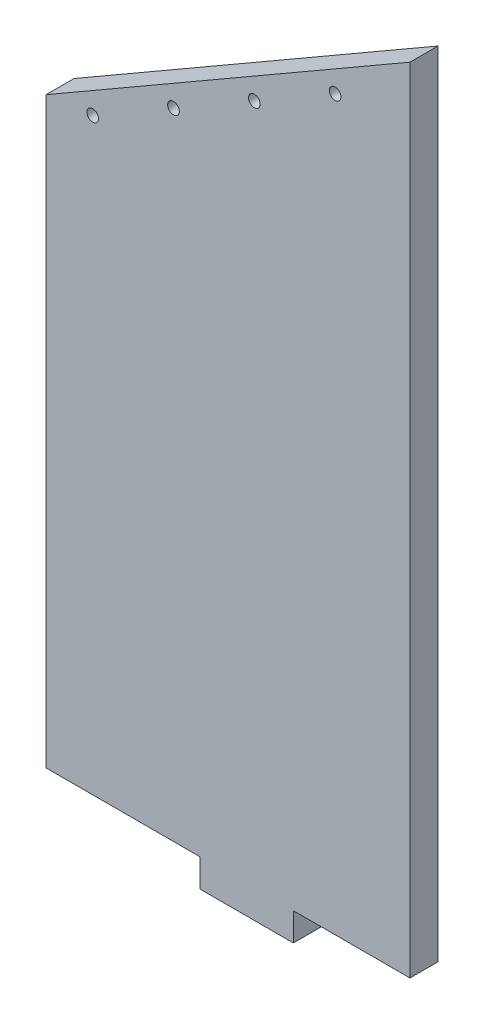
ISO-10303-21;
HEADER;
FILE_DESCRIPTION(('STEP AP214'),'2;1');
FILE_NAME('part.step','',(''),(''),'','','');
FILE_SCHEMA(('AUTOMOTIVE_DESIGN { 1 0 10303 214 1 1 1 1 }'));
ENDSEC;
DATA;
#1=APPLICATION_CONTEXT('core data for automotive mechanical design processes');
#2=APPLICATION_PROTOCOL_DEFINITION('international standard','automotive_design',2000,#1);
#3=PRODUCT_CONTEXT('',#1,'mechanical');
#4=PRODUCT('Part','Part','',(#3));
#5=PRODUCT_RELATED_PRODUCT_CATEGORY('part','',(#4));
#6=PRODUCT_DEFINITION_FORMATION('','',#4);
#7=PRODUCT_DEFINITION_CONTEXT('part definition',#1,'design');
#8=PRODUCT_DEFINITION('design','',#6,#7);
#9=PRODUCT_DEFINITION_SHAPE('','',#8);
#10=(LENGTH_UNIT() NAMED_UNIT(*) SI_UNIT(.MILLI.,.METRE.));
#11=(NAMED_UNIT(*) PLANE_ANGLE_UNIT() SI_UNIT($,.RADIAN.));
#12=(NAMED_UNIT(*) SI_UNIT($,.STERADIAN.) SOLID_ANGLE_UNIT());
#13=UNCERTAINTY_MEASURE_WITH_UNIT(LENGTH_MEASURE(1.E-05),#10,'distance_accuracy_value','');
#14=(GEOMETRIC_REPRESENTATION_CONTEXT(3) GLOBAL_UNCERTAINTY_ASSIGNED_CONTEXT((#13)) GLOBAL_UNIT_ASSIGNED_CONTEXT((#10,
#11,#12)) REPRESENTATION_CONTEXT('',''));
#15=CARTESIAN_POINT('',(0.,0.,0.));
#16=DIRECTION('',(0.,0.,1.));
#17=DIRECTION('',(1.,0.,0.));
#18=AXIS2_PLACEMENT_3D('',#15,#16,#17);
#19=CARTESIAN_POINT('',(0.,0.,6.));
#20=DIRECTION('',(0.,1.,0.));
#21=DIRECTION('',(-1.,0.,0.));
#22=AXIS2_PLACEMENT_3D('',#19,#20,#21);
#23=PLANE('',#22);
#24=DIRECTION('',(0.,0.,1.));
#25=VECTOR('',#24,1.);
#26=CARTESIAN_POINT('',(-25.,0.,0.));
#27=LINE('',#26,#25);
#28=CARTESIAN_POINT('',(-25.,0.,0.));
#29=VERTEX_POINT('',#28);
#30=CARTESIAN_POINT('',(-25.,0.,6.));
#31=VERTEX_POINT('',#30);
#32=EDGE_CURVE('E125',#29,#31,#27,.T.);
#33=ORIENTED_EDGE('',*,*,#32,.F.);
#34=DIRECTION('',(1.,0.,0.));
#35=VECTOR('',#34,1.);
#36=CARTESIAN_POINT('',(0.,0.,0.));
#37=LINE('',#36,#35);
#38=CARTESIAN_POINT('',(0.,0.,0.));
#39=VERTEX_POINT('',#38);
#40=EDGE_CURVE('E162',#29,#39,#37,.T.);
#41=ORIENTED_EDGE('',*,*,#40,.T.);
#42=DIRECTION('',(0.,0.,-1.));
#43=VECTOR('',#42,1.);
#44=CARTESIAN_POINT('',(0.,0.,6.));
#45=LINE('',#44,#43);
#46=CARTESIAN_POINT('',(0.,0.,6.));
#47=VERTEX_POINT('',#46);
#48=EDGE_CURVE('E179',#47,#39,#45,.T.);
#49=ORIENTED_EDGE('',*,*,#48,.F.);
#50=DIRECTION('',(1.,0.,0.));
#51=VECTOR('',#50,1.);
#52=CARTESIAN_POINT('',(0.,0.,6.));
#53=LINE('',#52,#51);
#54=EDGE_CURVE('E52',#31,#47,#53,.T.);
#55=ORIENTED_EDGE('',*,*,#54,.F.);
#56=EDGE_LOOP('',(#33,#41,#49,#55));
#57=FACE_BOUND('',#56,.T.);
#58=ADVANCED_FACE('F35',(#57),#23,.F.);
#59=DIRECTION('',(0.,0.,-1.));
#60=VECTOR('',#59,1.);
#61=CARTESIAN_POINT('',(-45.,0.,0.));
#62=LINE('',#61,#60);
#63=CARTESIAN_POINT('',(-45.,0.,6.));
#64=VERTEX_POINT('',#63);
#65=CARTESIAN_POINT('',(-45.,0.,0.));
#66=VERTEX_POINT('',#65);
#67=EDGE_CURVE('E60',#64,#66,#62,.T.);
#68=ORIENTED_EDGE('',*,*,#67,.F.);
#69=CARTESIAN_POINT('',(-78.,0.,6.));
#70=VERTEX_POINT('',#69);
#71=EDGE_CURVE('E175',#70,#64,#53,.T.);
#72=ORIENTED_EDGE('',*,*,#71,.F.);
#73=DIRECTION('',(0.,0.,-1.));
#74=VECTOR('',#73,1.);
#75=CARTESIAN_POINT('',(-78.,0.,6.));
#76=LINE('',#75,#74);
#77=CARTESIAN_POINT('',(-78.,0.,0.));
#78=VERTEX_POINT('',#77);
#79=EDGE_CURVE('E182',#70,#78,#76,.T.);
#80=ORIENTED_EDGE('',*,*,#79,.T.);
#81=EDGE_CURVE('E166',#78,#66,#37,.T.);
#82=ORIENTED_EDGE('',*,*,#81,.T.);
#83=EDGE_LOOP('',(#68,#72,#80,#82));
#84=FACE_BOUND('',#83,.T.);
#85=ADVANCED_FACE('F225',(#84),#23,.F.);
#86=CARTESIAN_POINT('',(0.,0.,6.));
#87=DIRECTION('',(-1.,0.,0.));
#88=DIRECTION('',(0.,0.,1.));
#89=AXIS2_PLACEMENT_3D('',#86,#87,#88);
#90=PLANE('',#89);
#91=DIRECTION('',(0.,1.,0.));
#92=VECTOR('',#91,1.);
#93=CARTESIAN_POINT('',(0.,0.,0.));
#94=LINE('',#93,#92);
#95=CARTESIAN_POINT('',(0.,170.,0.));
#96=VERTEX_POINT('',#95);
#97=EDGE_CURVE('E164',#39,#96,#94,.T.);
#98=ORIENTED_EDGE('',*,*,#97,.T.);
#99=DIRECTION('',(0.,0.,-1.));
#100=VECTOR('',#99,1.);
#101=CARTESIAN_POINT('',(0.,170.,6.));
#102=LINE('',#101,#100);
#103=CARTESIAN_POINT('',(0.,170.,6.));
#104=VERTEX_POINT('',#103);
#105=EDGE_CURVE('E11',#104,#96,#102,.T.);
#106=ORIENTED_EDGE('',*,*,#105,.F.);
#107=DIRECTION('',(0.,1.,0.));
#108=VECTOR('',#107,1.);
#109=CARTESIAN_POINT('',(0.,0.,6.));
#110=LINE('',#109,#108);
#111=EDGE_CURVE('E169',#47,#104,#110,.T.);
#112=ORIENTED_EDGE('',*,*,#111,.F.);
#113=ORIENTED_EDGE('',*,*,#48,.T.);
#114=EDGE_LOOP('',(#98,#106,#112,#113));
#115=FACE_BOUND('',#114,.T.);
#116=ADVANCED_FACE('F37',(#115),#90,.F.);
#117=CARTESIAN_POINT('',(-78.,124.966679003209,6.));
#118=DIRECTION('',(0.499999999999998,-0.86602540378444,0.));
#119=DIRECTION('',(0.86602540378444,0.499999999999998,0.));
#120=AXIS2_PLACEMENT_3D('',#117,#118,#119);
#121=PLANE('',#120);
#122=DIRECTION('',(-0.86602540378444,-0.499999999999998,0.));
#123=VECTOR('',#122,1.);
#124=CARTESIAN_POINT('',(-78.,124.966679003209,0.));
#125=LINE('',#124,#123);
#126=CARTESIAN_POINT('',(-78.,124.966679003209,0.));
#127=VERTEX_POINT('',#126);
#128=EDGE_CURVE('E171',#96,#127,#125,.T.);
#129=ORIENTED_EDGE('',*,*,#128,.T.);
#130=DIRECTION('',(0.,0.,-1.));
#131=VECTOR('',#130,1.);
#132=CARTESIAN_POINT('',(-78.,124.966679003209,6.));
#133=LINE('',#132,#131);
#134=CARTESIAN_POINT('',(-78.,124.966679003209,6.));
#135=VERTEX_POINT('',#134);
#136=EDGE_CURVE('E44',#135,#127,#133,.T.);
#137=ORIENTED_EDGE('',*,*,#136,.F.);
#138=DIRECTION('',(-0.86602540378444,-0.499999999999998,0.));
#139=VECTOR('',#138,1.);
#140=CARTESIAN_POINT('',(-78.,124.966679003209,6.));
#141=LINE('',#140,#139);
#142=EDGE_CURVE('E210',#104,#135,#141,.T.);
#143=ORIENTED_EDGE('',*,*,#142,.F.);
#144=ORIENTED_EDGE('',*,*,#105,.T.);
#145=EDGE_LOOP('',(#129,#137,#143,#144));
#146=FACE_BOUND('',#145,.T.);
#147=ADVANCED_FACE('F218',(#146),#121,.F.);
#148=CARTESIAN_POINT('',(-78.,0.,6.));
#149=DIRECTION('',(1.,0.,0.));
#150=DIRECTION('',(0.,0.,-1.));
#151=AXIS2_PLACEMENT_3D('',#148,#149,#150);
#152=PLANE('',#151);
#153=DIRECTION('',(0.,-1.,0.));
#154=VECTOR('',#153,1.);
#155=CARTESIAN_POINT('',(-78.,0.,0.));
#156=LINE('',#155,#154);
#157=EDGE_CURVE('E167',#127,#78,#156,.T.);
#158=ORIENTED_EDGE('',*,*,#157,.T.);
#159=ORIENTED_EDGE('',*,*,#79,.F.);
#160=DIRECTION('',(0.,-1.,0.));
#161=VECTOR('',#160,1.);
#162=CARTESIAN_POINT('',(-78.,0.,6.));
#163=LINE('',#162,#161);
#164=EDGE_CURVE('E212',#135,#70,#163,.T.);
#165=ORIENTED_EDGE('',*,*,#164,.F.);
#166=ORIENTED_EDGE('',*,*,#136,.T.);
#167=EDGE_LOOP('',(#158,#159,#165,#166));
#168=FACE_BOUND('',#167,.T.);
#169=ADVANCED_FACE('F223',(#168),#152,.F.);
#170=CARTESIAN_POINT('',(0.,0.,6.));
#171=DIRECTION('',(0.,0.,1.));
#172=DIRECTION('',(1.,0.,0.));
#173=AXIS2_PLACEMENT_3D('',#170,#171,#172);
#174=PLANE('',#173);
#175=CARTESIAN_POINT('',(-33.3589838486225,146.121379541588,6.));
#176=DIRECTION('',(0.,0.,1.));
#177=DIRECTION('',(1.,0.,0.));
#178=AXIS2_PLACEMENT_3D('',#175,#176,#177);
#179=CIRCLE('',#178,1.25);
#180=CARTESIAN_POINT('',(-32.1089838486225,146.121379541588,6.));
#181=VERTEX_POINT('',#180);
#182=EDGE_CURVE('E126',#181,#181,#179,.T.);
#183=ORIENTED_EDGE('',*,*,#182,.F.);
#184=EDGE_LOOP('',(#183));
#185=FACE_BOUND('',#184,.T.);
#186=CARTESIAN_POINT('',(-16.0384757729337,156.121379541588,6.));
#187=DIRECTION('',(0.,0.,1.));
#188=DIRECTION('',(1.,0.,0.));
#189=AXIS2_PLACEMENT_3D('',#186,#187,#188);
#190=CIRCLE('',#189,1.25);
#191=CARTESIAN_POINT('',(-14.7884757729337,156.121379541588,6.));
#192=VERTEX_POINT('',#191);
#193=EDGE_CURVE('E197',#192,#192,#190,.T.);
#194=ORIENTED_EDGE('',*,*,#193,.F.);
#195=EDGE_LOOP('',(#194));
#196=FACE_BOUND('',#195,.T.);
#197=CARTESIAN_POINT('',(-50.6794919243112,136.121379541588,6.));
#198=DIRECTION('',(0.,0.,1.));
#199=DIRECTION('',(1.,0.,0.));
#200=AXIS2_PLACEMENT_3D('',#197,#198,#199);
#201=CIRCLE('',#200,1.25);
#202=CARTESIAN_POINT('',(-49.4294919243112,136.121379541588,6.));
#203=VERTEX_POINT('',#202);
#204=EDGE_CURVE('E194',#203,#203,#201,.T.);
#205=ORIENTED_EDGE('',*,*,#204,.F.);
#206=EDGE_LOOP('',(#205));
#207=FACE_BOUND('',#206,.T.);
#208=CARTESIAN_POINT('',(-68.,126.121379541588,6.));
#209=DIRECTION('',(0.,0.,1.));
#210=DIRECTION('',(1.,0.,0.));
#211=AXIS2_PLACEMENT_3D('',#208,#209,#210);
#212=CIRCLE('',#211,1.25);
#213=CARTESIAN_POINT('',(-66.75,126.121379541588,6.));
#214=VERTEX_POINT('',#213);
#215=EDGE_CURVE('E190',#214,#214,#212,.T.);
#216=ORIENTED_EDGE('',*,*,#215,.F.);
#217=EDGE_LOOP('',(#216));
#218=FACE_BOUND('',#217,.T.);
#219=ORIENTED_EDGE('',*,*,#111,.T.);
#220=ORIENTED_EDGE('',*,*,#142,.T.);
#221=ORIENTED_EDGE('',*,*,#164,.T.);
#222=ORIENTED_EDGE('',*,*,#71,.T.);
#223=DIRECTION('',(0.,1.,0.));
#224=VECTOR('',#223,1.);
#225=CARTESIAN_POINT('',(-45.,-6.00000000000001,6.));
#226=LINE('',#225,#224);
#227=CARTESIAN_POINT('',(-45.,-6.00000000000001,6.));
#228=VERTEX_POINT('',#227);
#229=EDGE_CURVE('E110',#228,#64,#226,.T.);
#230=ORIENTED_EDGE('',*,*,#229,.F.);
#231=DIRECTION('',(-1.,0.,0.));
#232=VECTOR('',#231,1.);
#233=CARTESIAN_POINT('',(-25.,-6.,6.));
#234=LINE('',#233,#232);
#235=CARTESIAN_POINT('',(-25.,-6.,6.));
#236=VERTEX_POINT('',#235);
#237=EDGE_CURVE('E102',#236,#228,#234,.T.);
#238=ORIENTED_EDGE('',*,*,#237,.F.);
#239=DIRECTION('',(0.,1.,0.));
#240=VECTOR('',#239,1.);
#241=CARTESIAN_POINT('',(-25.,-6.,6.));
#242=LINE('',#241,#240);
#243=EDGE_CURVE('E107',#236,#31,#242,.T.);
#244=ORIENTED_EDGE('',*,*,#243,.T.);
#245=ORIENTED_EDGE('',*,*,#54,.T.);
#246=EDGE_LOOP('',(#219,#220,#221,#222,#230,#238,#244,#245));
#247=FACE_BOUND('',#246,.T.);
#248=ADVANCED_FACE('F105',(#185,#196,#207,#218,#247),#174,.T.);
#249=CARTESIAN_POINT('',(0.,0.,0.));
#250=DIRECTION('',(0.,0.,1.));
#251=DIRECTION('',(1.,0.,0.));
#252=AXIS2_PLACEMENT_3D('',#249,#250,#251);
#253=PLANE('',#252);
#254=CARTESIAN_POINT('',(-33.3589838486225,146.121379541588,0.));
#255=DIRECTION('',(0.,0.,1.));
#256=DIRECTION('',(1.,0.,0.));
#257=AXIS2_PLACEMENT_3D('',#254,#255,#256);
#258=CIRCLE('',#257,1.25);
#259=CARTESIAN_POINT('',(-32.1089838486225,146.121379541588,0.));
#260=VERTEX_POINT('',#259);
#261=EDGE_CURVE('E129',#260,#260,#258,.T.);
#262=ORIENTED_EDGE('',*,*,#261,.T.);
#263=EDGE_LOOP('',(#262));
#264=FACE_BOUND('',#263,.T.);
#265=CARTESIAN_POINT('',(-16.0384757729337,156.121379541588,0.));
#266=DIRECTION('',(0.,0.,1.));
#267=DIRECTION('',(1.,0.,0.));
#268=AXIS2_PLACEMENT_3D('',#265,#266,#267);
#269=CIRCLE('',#268,1.25);
#270=CARTESIAN_POINT('',(-14.7884757729337,156.121379541588,0.));
#271=VERTEX_POINT('',#270);
#272=EDGE_CURVE('E195',#271,#271,#269,.T.);
#273=ORIENTED_EDGE('',*,*,#272,.T.);
#274=EDGE_LOOP('',(#273));
#275=FACE_BOUND('',#274,.T.);
#276=CARTESIAN_POINT('',(-50.6794919243112,136.121379541588,0.));
#277=DIRECTION('',(0.,0.,1.));
#278=DIRECTION('',(1.,0.,0.));
#279=AXIS2_PLACEMENT_3D('',#276,#277,#278);
#280=CIRCLE('',#279,1.25);
#281=CARTESIAN_POINT('',(-49.4294919243112,136.121379541588,0.));
#282=VERTEX_POINT('',#281);
#283=EDGE_CURVE('E191',#282,#282,#280,.T.);
#284=ORIENTED_EDGE('',*,*,#283,.T.);
#285=EDGE_LOOP('',(#284));
#286=FACE_BOUND('',#285,.T.);
#287=CARTESIAN_POINT('',(-68.,126.121379541588,0.));
#288=DIRECTION('',(0.,0.,1.));
#289=DIRECTION('',(1.,0.,0.));
#290=AXIS2_PLACEMENT_3D('',#287,#288,#289);
#291=CIRCLE('',#290,1.25);
#292=CARTESIAN_POINT('',(-66.75,126.121379541588,0.));
#293=VERTEX_POINT('',#292);
#294=EDGE_CURVE('E187',#293,#293,#291,.T.);
#295=ORIENTED_EDGE('',*,*,#294,.T.);
#296=EDGE_LOOP('',(#295));
#297=FACE_BOUND('',#296,.T.);
#298=ORIENTED_EDGE('',*,*,#97,.F.);
#299=ORIENTED_EDGE('',*,*,#40,.F.);
#300=DIRECTION('',(0.,1.,0.));
#301=VECTOR('',#300,1.);
#302=CARTESIAN_POINT('',(-25.,-6.,0.));
#303=LINE('',#302,#301);
#304=CARTESIAN_POINT('',(-25.,-6.,0.));
#305=VERTEX_POINT('',#304);
#306=EDGE_CURVE('E139',#305,#29,#303,.T.);
#307=ORIENTED_EDGE('',*,*,#306,.F.);
#308=DIRECTION('',(1.,0.,0.));
#309=VECTOR('',#308,1.);
#310=CARTESIAN_POINT('',(-25.,-6.,0.));
#311=LINE('',#310,#309);
#312=CARTESIAN_POINT('',(-45.,-6.00000000000001,0.));
#313=VERTEX_POINT('',#312);
#314=EDGE_CURVE('E119',#313,#305,#311,.T.);
#315=ORIENTED_EDGE('',*,*,#314,.F.);
#316=DIRECTION('',(0.,1.,0.));
#317=VECTOR('',#316,1.);
#318=CARTESIAN_POINT('',(-45.,-6.00000000000001,0.));
#319=LINE('',#318,#317);
#320=EDGE_CURVE('E131',#313,#66,#319,.T.);
#321=ORIENTED_EDGE('',*,*,#320,.T.);
#322=ORIENTED_EDGE('',*,*,#81,.F.);
#323=ORIENTED_EDGE('',*,*,#157,.F.);
#324=ORIENTED_EDGE('',*,*,#128,.F.);
#325=EDGE_LOOP('',(#298,#299,#307,#315,#321,#322,#323,#324));
#326=FACE_BOUND('',#325,.T.);
#327=ADVANCED_FACE('F160',(#264,#275,#286,#297,#326),#253,.F.);
#328=CARTESIAN_POINT('',(-68.,126.121379541588,-4.));
#329=DIRECTION('',(0.,0.,1.));
#330=DIRECTION('',(1.,0.,0.));
#331=AXIS2_PLACEMENT_3D('',#328,#329,#330);
#332=CYLINDRICAL_SURFACE('',#331,1.25);
#333=ORIENTED_EDGE('',*,*,#215,.T.);
#334=EDGE_LOOP('',(#333));
#335=FACE_BOUND('',#334,.T.);
#336=ORIENTED_EDGE('',*,*,#294,.F.);
#337=EDGE_LOOP('',(#336));
#338=FACE_BOUND('',#337,.T.);
#339=ADVANCED_FACE('F248',(#335,#338),#332,.F.);
#340=CARTESIAN_POINT('',(-50.6794919243112,136.121379541588,-4.));
#341=DIRECTION('',(0.,0.,1.));
#342=DIRECTION('',(1.,0.,0.));
#343=AXIS2_PLACEMENT_3D('',#340,#341,#342);
#344=CYLINDRICAL_SURFACE('',#343,1.25);
#345=ORIENTED_EDGE('',*,*,#204,.T.);
#346=EDGE_LOOP('',(#345));
#347=FACE_BOUND('',#346,.T.);
#348=ORIENTED_EDGE('',*,*,#283,.F.);
#349=EDGE_LOOP('',(#348));
#350=FACE_BOUND('',#349,.T.);
#351=ADVANCED_FACE('F254',(#347,#350),#344,.F.);
#352=CARTESIAN_POINT('',(-16.0384757729337,156.121379541588,-4.));
#353=DIRECTION('',(0.,0.,1.));
#354=DIRECTION('',(1.,0.,0.));
#355=AXIS2_PLACEMENT_3D('',#352,#353,#354);
#356=CYLINDRICAL_SURFACE('',#355,1.25);
#357=ORIENTED_EDGE('',*,*,#193,.T.);
#358=EDGE_LOOP('',(#357));
#359=FACE_BOUND('',#358,.T.);
#360=ORIENTED_EDGE('',*,*,#272,.F.);
#361=EDGE_LOOP('',(#360));
#362=FACE_BOUND('',#361,.T.);
#363=ADVANCED_FACE('F258',(#359,#362),#356,.F.);
#364=CARTESIAN_POINT('',(-33.3589838486225,146.121379541588,-4.));
#365=DIRECTION('',(0.,0.,1.));
#366=DIRECTION('',(1.,0.,0.));
#367=AXIS2_PLACEMENT_3D('',#364,#365,#366);
#368=CYLINDRICAL_SURFACE('',#367,1.25);
#369=ORIENTED_EDGE('',*,*,#182,.T.);
#370=EDGE_LOOP('',(#369));
#371=FACE_BOUND('',#370,.T.);
#372=ORIENTED_EDGE('',*,*,#261,.F.);
#373=EDGE_LOOP('',(#372));
#374=FACE_BOUND('',#373,.T.);
#375=ADVANCED_FACE('F262',(#371,#374),#368,.F.);
#376=CARTESIAN_POINT('',(-25.,-6.,0.));
#377=DIRECTION('',(-1.,0.,0.));
#378=DIRECTION('',(0.,-1.,0.));
#379=AXIS2_PLACEMENT_3D('',#376,#377,#378);
#380=PLANE('',#379);
#381=ORIENTED_EDGE('',*,*,#32,.T.);
#382=ORIENTED_EDGE('',*,*,#243,.F.);
#383=DIRECTION('',(0.,0.,1.));
#384=VECTOR('',#383,1.);
#385=CARTESIAN_POINT('',(-25.,-6.,0.));
#386=LINE('',#385,#384);
#387=EDGE_CURVE('E114',#305,#236,#386,.T.);
#388=ORIENTED_EDGE('',*,*,#387,.F.);
#389=ORIENTED_EDGE('',*,*,#306,.T.);
#390=EDGE_LOOP('',(#381,#382,#388,#389));
#391=FACE_BOUND('',#390,.T.);
#392=ADVANCED_FACE('F124',(#391),#380,.F.);
#393=CARTESIAN_POINT('',(-45.,-6.00000000000001,0.));
#394=DIRECTION('',(1.,0.,0.));
#395=DIRECTION('',(0.,1.,0.));
#396=AXIS2_PLACEMENT_3D('',#393,#394,#395);
#397=PLANE('',#396);
#398=ORIENTED_EDGE('',*,*,#67,.T.);
#399=ORIENTED_EDGE('',*,*,#320,.F.);
#400=DIRECTION('',(0.,0.,-1.));
#401=VECTOR('',#400,1.);
#402=CARTESIAN_POINT('',(-45.,-6.00000000000001,0.));
#403=LINE('',#402,#401);
#404=EDGE_CURVE('E113',#228,#313,#403,.T.);
#405=ORIENTED_EDGE('',*,*,#404,.F.);
#406=ORIENTED_EDGE('',*,*,#229,.T.);
#407=EDGE_LOOP('',(#398,#399,#405,#406));
#408=FACE_BOUND('',#407,.T.);
#409=ADVANCED_FACE('F158',(#408),#397,.F.);
#410=CARTESIAN_POINT('',(0.,-6.,0.));
#411=DIRECTION('',(0.,-1.,0.));
#412=DIRECTION('',(1.,0.,0.));
#413=AXIS2_PLACEMENT_3D('',#410,#411,#412);
#414=PLANE('',#413);
#415=ORIENTED_EDGE('',*,*,#387,.T.);
#416=ORIENTED_EDGE('',*,*,#237,.T.);
#417=ORIENTED_EDGE('',*,*,#404,.T.);
#418=ORIENTED_EDGE('',*,*,#314,.T.);
#419=EDGE_LOOP('',(#415,#416,#417,#418));
#420=FACE_BOUND('',#419,.T.);
#421=ADVANCED_FACE('F117',(#420),#414,.T.);
#422=CLOSED_SHELL('',(#58,#85,#116,#147,#169,#248,#327,#339,#351,#363,#375,#392,#409,#421));
#423=MANIFOLD_SOLID_BREP('B2',#422);
#424=ADVANCED_BREP_SHAPE_REPRESENTATION('',(#18,#423),#14);
#425=SHAPE_DEFINITION_REPRESENTATION(#9,#424);
ENDSEC;
END-ISO-10303-21;
